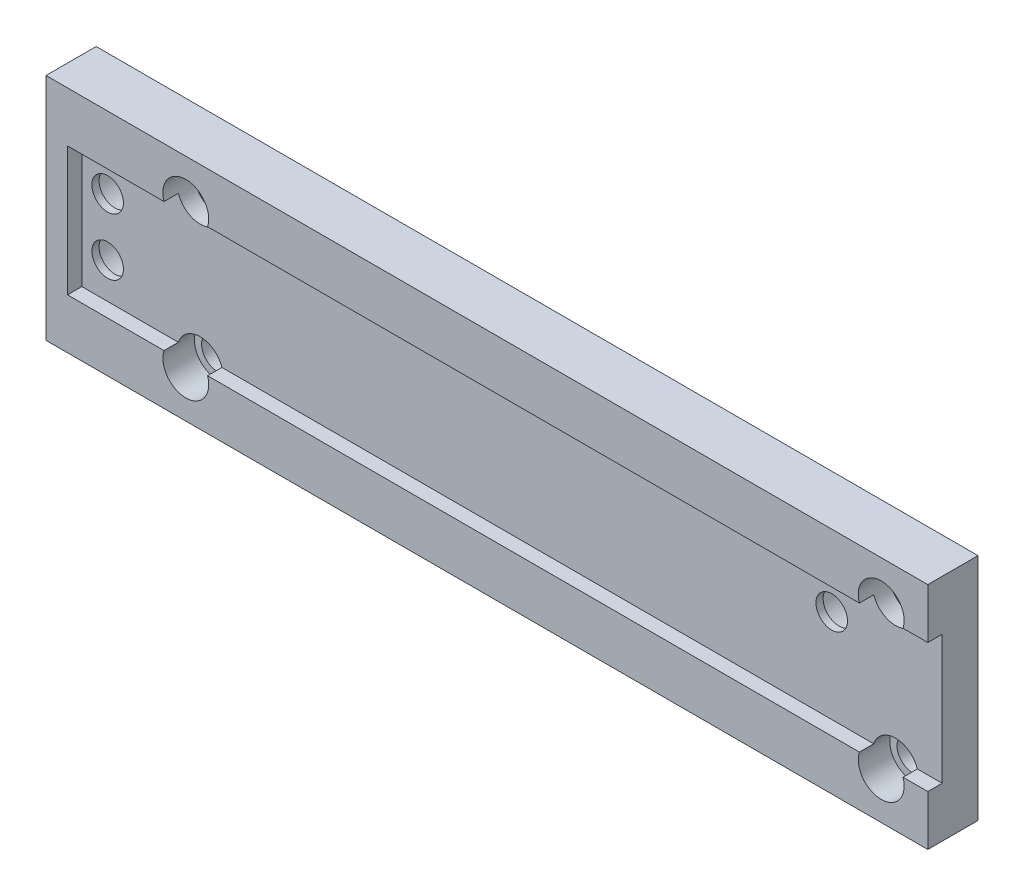
ISO-10303-21;
HEADER;
FILE_DESCRIPTION(('STEP AP214'),'2;1');
FILE_NAME('part.step','',(''),(''),'','','');
FILE_SCHEMA(('AUTOMOTIVE_DESIGN { 1 0 10303 214 1 1 1 1 }'));
ENDSEC;
DATA;
#1=APPLICATION_CONTEXT('core data for automotive mechanical design processes');
#2=APPLICATION_PROTOCOL_DEFINITION('international standard','automotive_design',2000,#1);
#3=PRODUCT_CONTEXT('',#1,'mechanical');
#4=PRODUCT('Part','Part','',(#3));
#5=PRODUCT_RELATED_PRODUCT_CATEGORY('part','',(#4));
#6=PRODUCT_DEFINITION_FORMATION('','',#4);
#7=PRODUCT_DEFINITION_CONTEXT('part definition',#1,'design');
#8=PRODUCT_DEFINITION('design','',#6,#7);
#9=PRODUCT_DEFINITION_SHAPE('','',#8);
#10=(LENGTH_UNIT() NAMED_UNIT(*) SI_UNIT(.MILLI.,.METRE.));
#11=(NAMED_UNIT(*) PLANE_ANGLE_UNIT() SI_UNIT($,.RADIAN.));
#12=(NAMED_UNIT(*) SI_UNIT($,.STERADIAN.) SOLID_ANGLE_UNIT());
#13=UNCERTAINTY_MEASURE_WITH_UNIT(LENGTH_MEASURE(1.E-05),#10,'distance_accuracy_value','');
#14=(GEOMETRIC_REPRESENTATION_CONTEXT(3) GLOBAL_UNCERTAINTY_ASSIGNED_CONTEXT((#13)) GLOBAL_UNIT_ASSIGNED_CONTEXT((#10,
#11,#12)) REPRESENTATION_CONTEXT('',''));
#15=CARTESIAN_POINT('',(0.,0.,0.));
#16=DIRECTION('',(0.,0.,1.));
#17=DIRECTION('',(1.,0.,0.));
#18=AXIS2_PLACEMENT_3D('',#15,#16,#17);
#19=CARTESIAN_POINT('',(-27.45,2.,0.));
#20=DIRECTION('',(0.,0.,1.));
#21=DIRECTION('',(1.,0.,0.));
#22=AXIS2_PLACEMENT_3D('',#19,#20,#21);
#23=CYLINDRICAL_SURFACE('',#22,1.1);
#24=CARTESIAN_POINT('',(-27.45,2.,2.5));
#25=DIRECTION('',(0.,0.,1.));
#26=DIRECTION('',(1.,0.,0.));
#27=AXIS2_PLACEMENT_3D('',#24,#25,#26);
#28=CIRCLE('',#27,1.1);
#29=CARTESIAN_POINT('',(-26.35,2.,2.5));
#30=VERTEX_POINT('',#29);
#31=EDGE_CURVE('E188',#30,#30,#28,.T.);
#32=ORIENTED_EDGE('',*,*,#31,.T.);
#33=EDGE_LOOP('',(#32));
#34=FACE_BOUND('',#33,.T.);
#35=CARTESIAN_POINT('',(-27.45,2.,2.));
#36=DIRECTION('',(0.,0.,-1.));
#37=DIRECTION('',(-1.,0.,0.));
#38=AXIS2_PLACEMENT_3D('',#35,#36,#37);
#39=CIRCLE('',#38,1.1);
#40=CARTESIAN_POINT('',(-28.55,2.,2.));
#41=VERTEX_POINT('',#40);
#42=EDGE_CURVE('E45',#41,#41,#39,.F.);
#43=ORIENTED_EDGE('',*,*,#42,.F.);
#44=EDGE_LOOP('',(#43));
#45=FACE_BOUND('',#44,.T.);
#46=ADVANCED_FACE('F41',(#34,#45),#23,.F.);
#47=CARTESIAN_POINT('',(-27.45,-2.,0.));
#48=DIRECTION('',(0.,0.,1.));
#49=DIRECTION('',(1.,0.,0.));
#50=AXIS2_PLACEMENT_3D('',#47,#48,#49);
#51=CYLINDRICAL_SURFACE('',#50,1.1);
#52=CARTESIAN_POINT('',(-27.45,-2.,2.5));
#53=DIRECTION('',(0.,0.,1.));
#54=DIRECTION('',(1.,0.,0.));
#55=AXIS2_PLACEMENT_3D('',#52,#53,#54);
#56=CIRCLE('',#55,1.1);
#57=CARTESIAN_POINT('',(-26.35,-2.,2.5));
#58=VERTEX_POINT('',#57);
#59=EDGE_CURVE('E194',#58,#58,#56,.T.);
#60=ORIENTED_EDGE('',*,*,#59,.T.);
#61=EDGE_LOOP('',(#60));
#62=FACE_BOUND('',#61,.T.);
#63=CARTESIAN_POINT('',(-27.45,-2.,2.));
#64=DIRECTION('',(0.,0.,-1.));
#65=DIRECTION('',(-1.,0.,0.));
#66=AXIS2_PLACEMENT_3D('',#63,#64,#65);
#67=CIRCLE('',#66,1.1);
#68=CARTESIAN_POINT('',(-28.55,-2.,2.));
#69=VERTEX_POINT('',#68);
#70=EDGE_CURVE('E300',#69,#69,#67,.F.);
#71=ORIENTED_EDGE('',*,*,#70,.F.);
#72=EDGE_LOOP('',(#71));
#73=FACE_BOUND('',#72,.T.);
#74=ADVANCED_FACE('F464',(#62,#73),#51,.F.);
#75=CARTESIAN_POINT('',(23.05,2.,0.));
#76=DIRECTION('',(0.,0.,1.));
#77=DIRECTION('',(1.,0.,0.));
#78=AXIS2_PLACEMENT_3D('',#75,#76,#77);
#79=CYLINDRICAL_SURFACE('',#78,1.1);
#80=CARTESIAN_POINT('',(23.05,2.,2.5));
#81=DIRECTION('',(0.,0.,1.));
#82=DIRECTION('',(1.,0.,0.));
#83=AXIS2_PLACEMENT_3D('',#80,#81,#82);
#84=CIRCLE('',#83,1.1);
#85=CARTESIAN_POINT('',(24.15,2.,2.5));
#86=VERTEX_POINT('',#85);
#87=EDGE_CURVE('E373',#86,#86,#84,.T.);
#88=ORIENTED_EDGE('',*,*,#87,.T.);
#89=EDGE_LOOP('',(#88));
#90=FACE_BOUND('',#89,.T.);
#91=CARTESIAN_POINT('',(23.05,2.,2.));
#92=DIRECTION('',(0.,0.,-1.));
#93=DIRECTION('',(-1.,0.,0.));
#94=AXIS2_PLACEMENT_3D('',#91,#92,#93);
#95=CIRCLE('',#94,1.1);
#96=CARTESIAN_POINT('',(21.95,2.,2.));
#97=VERTEX_POINT('',#96);
#98=EDGE_CURVE('E297',#97,#97,#95,.F.);
#99=ORIENTED_EDGE('',*,*,#98,.F.);
#100=EDGE_LOOP('',(#99));
#101=FACE_BOUND('',#100,.T.);
#102=ADVANCED_FACE('F470',(#90,#101),#79,.F.);
#103=CARTESIAN_POINT('',(-29.25,-4.5,2.5));
#104=DIRECTION('',(0.,-1.,0.));
#105=DIRECTION('',(0.,0.,-1.));
#106=AXIS2_PLACEMENT_3D('',#103,#104,#105);
#107=PLANE('',#106);
#108=DIRECTION('',(1.,0.,0.));
#109=VECTOR('',#108,1.);
#110=CARTESIAN_POINT('',(-29.25,-4.5,2.5));
#111=LINE('',#110,#109);
#112=CARTESIAN_POINT('',(-19.4801315846429,-4.5,2.5));
#113=VERTEX_POINT('',#112);
#114=CARTESIAN_POINT('',(25.9801315846429,-4.5,2.5));
#115=VERTEX_POINT('',#114);
#116=EDGE_CURVE('E394',#113,#115,#111,.T.);
#117=ORIENTED_EDGE('',*,*,#116,.F.);
#118=DIRECTION('',(0.,0.,1.));
#119=VECTOR('',#118,1.);
#120=CARTESIAN_POINT('',(-19.4801315846429,-4.5,1.3));
#121=LINE('',#120,#119);
#122=CARTESIAN_POINT('',(-19.4801315846429,-4.5,3.5));
#123=VERTEX_POINT('',#122);
#124=EDGE_CURVE('E66',#113,#123,#121,.T.);
#125=ORIENTED_EDGE('',*,*,#124,.T.);
#126=DIRECTION('',(1.,0.,0.));
#127=VECTOR('',#126,1.);
#128=CARTESIAN_POINT('',(-29.25,-4.5,3.5));
#129=LINE('',#128,#127);
#130=CARTESIAN_POINT('',(25.9801315846429,-4.5,3.5));
#131=VERTEX_POINT('',#130);
#132=EDGE_CURVE('E207',#123,#131,#129,.T.);
#133=ORIENTED_EDGE('',*,*,#132,.T.);
#134=DIRECTION('',(0.,0.,1.));
#135=VECTOR('',#134,1.);
#136=CARTESIAN_POINT('',(25.9801315846429,-4.5,1.3));
#137=LINE('',#136,#135);
#138=EDGE_CURVE('E178',#131,#115,#137,.F.);
#139=ORIENTED_EDGE('',*,*,#138,.T.);
#140=EDGE_LOOP('',(#117,#125,#133,#139));
#141=FACE_BOUND('',#140,.T.);
#142=ADVANCED_FACE('F436',(#141),#107,.F.);
#143=CARTESIAN_POINT('',(29.0198684153571,-4.5,2.5));
#144=VERTEX_POINT('',#143);
#145=CARTESIAN_POINT('',(30.75,-4.5,2.5));
#146=VERTEX_POINT('',#145);
#147=EDGE_CURVE('E391',#144,#146,#111,.T.);
#148=ORIENTED_EDGE('',*,*,#147,.F.);
#149=DIRECTION('',(0.,0.,1.));
#150=VECTOR('',#149,1.);
#151=CARTESIAN_POINT('',(29.0198684153571,-4.5,1.3));
#152=LINE('',#151,#150);
#153=CARTESIAN_POINT('',(29.0198684153571,-4.5,3.5));
#154=VERTEX_POINT('',#153);
#155=EDGE_CURVE('E59',#144,#154,#152,.T.);
#156=ORIENTED_EDGE('',*,*,#155,.T.);
#157=CARTESIAN_POINT('',(30.75,-4.5,3.5));
#158=VERTEX_POINT('',#157);
#159=EDGE_CURVE('E204',#154,#158,#129,.T.);
#160=ORIENTED_EDGE('',*,*,#159,.T.);
#161=DIRECTION('',(0.,0.,1.));
#162=VECTOR('',#161,1.);
#163=CARTESIAN_POINT('',(30.75,-4.5,2.5));
#164=LINE('',#163,#162);
#165=EDGE_CURVE('E214',#146,#158,#164,.T.);
#166=ORIENTED_EDGE('',*,*,#165,.F.);
#167=EDGE_LOOP('',(#148,#156,#160,#166));
#168=FACE_BOUND('',#167,.T.);
#169=ADVANCED_FACE('F407',(#168),#107,.F.);
#170=CARTESIAN_POINT('',(-29.25,4.5,2.5));
#171=DIRECTION('',(0.,1.,0.));
#172=DIRECTION('',(0.,0.,1.));
#173=AXIS2_PLACEMENT_3D('',#170,#171,#172);
#174=PLANE('',#173);
#175=DIRECTION('',(-1.,0.,0.));
#176=VECTOR('',#175,1.);
#177=CARTESIAN_POINT('',(-29.25,4.5,2.5));
#178=LINE('',#177,#176);
#179=CARTESIAN_POINT('',(25.9801315846429,4.5,2.5));
#180=VERTEX_POINT('',#179);
#181=CARTESIAN_POINT('',(-19.4801315846429,4.5,2.5));
#182=VERTEX_POINT('',#181);
#183=EDGE_CURVE('E388',#180,#182,#178,.T.);
#184=ORIENTED_EDGE('',*,*,#183,.F.);
#185=DIRECTION('',(0.,0.,1.));
#186=VECTOR('',#185,1.);
#187=CARTESIAN_POINT('',(25.9801315846429,4.5,1.3));
#188=LINE('',#187,#186);
#189=CARTESIAN_POINT('',(25.9801315846429,4.5,3.5));
#190=VERTEX_POINT('',#189);
#191=EDGE_CURVE('E363',#180,#190,#188,.T.);
#192=ORIENTED_EDGE('',*,*,#191,.T.);
#193=DIRECTION('',(-1.,0.,0.));
#194=VECTOR('',#193,1.);
#195=CARTESIAN_POINT('',(-29.25,4.5,3.5));
#196=LINE('',#195,#194);
#197=CARTESIAN_POINT('',(-19.4801315846429,4.5,3.5));
#198=VERTEX_POINT('',#197);
#199=EDGE_CURVE('E187',#190,#198,#196,.T.);
#200=ORIENTED_EDGE('',*,*,#199,.T.);
#201=DIRECTION('',(0.,0.,1.));
#202=VECTOR('',#201,1.);
#203=CARTESIAN_POINT('',(-19.4801315846429,4.5,1.3));
#204=LINE('',#203,#202);
#205=EDGE_CURVE('E161',#198,#182,#204,.F.);
#206=ORIENTED_EDGE('',*,*,#205,.T.);
#207=EDGE_LOOP('',(#184,#192,#200,#206));
#208=FACE_BOUND('',#207,.T.);
#209=ADVANCED_FACE('F421',(#208),#174,.F.);
#210=CARTESIAN_POINT('',(-22.5198684153571,4.5,2.5));
#211=VERTEX_POINT('',#210);
#212=CARTESIAN_POINT('',(-29.25,4.5,2.5));
#213=VERTEX_POINT('',#212);
#214=EDGE_CURVE('E176',#211,#213,#178,.T.);
#215=ORIENTED_EDGE('',*,*,#214,.F.);
#216=DIRECTION('',(0.,0.,1.));
#217=VECTOR('',#216,1.);
#218=CARTESIAN_POINT('',(-22.5198684153571,4.5,1.3));
#219=LINE('',#218,#217);
#220=CARTESIAN_POINT('',(-22.5198684153571,4.5,3.5));
#221=VERTEX_POINT('',#220);
#222=EDGE_CURVE('E158',#211,#221,#219,.T.);
#223=ORIENTED_EDGE('',*,*,#222,.T.);
#224=CARTESIAN_POINT('',(-29.25,4.5,3.5));
#225=VERTEX_POINT('',#224);
#226=EDGE_CURVE('E174',#221,#225,#196,.T.);
#227=ORIENTED_EDGE('',*,*,#226,.T.);
#228=DIRECTION('',(0.,0.,1.));
#229=VECTOR('',#228,1.);
#230=CARTESIAN_POINT('',(-29.25,4.5,2.5));
#231=LINE('',#230,#229);
#232=EDGE_CURVE('E222',#213,#225,#231,.T.);
#233=ORIENTED_EDGE('',*,*,#232,.F.);
#234=EDGE_LOOP('',(#215,#223,#227,#233));
#235=FACE_BOUND('',#234,.T.);
#236=ADVANCED_FACE('F172',(#235),#174,.F.);
#237=CARTESIAN_POINT('',(30.75,8.,3.5));
#238=DIRECTION('',(-1.,0.,0.));
#239=DIRECTION('',(0.,0.,1.));
#240=AXIS2_PLACEMENT_3D('',#237,#238,#239);
#241=PLANE('',#240);
#242=DIRECTION('',(0.,1.,0.));
#243=VECTOR('',#242,1.);
#244=CARTESIAN_POINT('',(30.75,4.5,2.5));
#245=LINE('',#244,#243);
#246=CARTESIAN_POINT('',(30.75,4.5,2.5));
#247=VERTEX_POINT('',#246);
#248=EDGE_CURVE('E213',#146,#247,#245,.T.);
#249=ORIENTED_EDGE('',*,*,#248,.F.);
#250=ORIENTED_EDGE('',*,*,#165,.T.);
#251=DIRECTION('',(0.,1.,0.));
#252=VECTOR('',#251,1.);
#253=CARTESIAN_POINT('',(30.75,8.,3.5));
#254=LINE('',#253,#252);
#255=CARTESIAN_POINT('',(30.75,-8.,3.5));
#256=VERTEX_POINT('',#255);
#257=EDGE_CURVE('E229',#256,#158,#254,.T.);
#258=ORIENTED_EDGE('',*,*,#257,.F.);
#259=DIRECTION('',(0.,0.,-1.));
#260=VECTOR('',#259,1.);
#261=CARTESIAN_POINT('',(30.75,-8.,3.5));
#262=LINE('',#261,#260);
#263=CARTESIAN_POINT('',(30.75,-8.,0.));
#264=VERTEX_POINT('',#263);
#265=EDGE_CURVE('E243',#256,#264,#262,.T.);
#266=ORIENTED_EDGE('',*,*,#265,.T.);
#267=DIRECTION('',(0.,1.,0.));
#268=VECTOR('',#267,1.);
#269=CARTESIAN_POINT('',(30.75,8.,0.));
#270=LINE('',#269,#268);
#271=CARTESIAN_POINT('',(30.75,8.,0.));
#272=VERTEX_POINT('',#271);
#273=EDGE_CURVE('E218',#264,#272,#270,.T.);
#274=ORIENTED_EDGE('',*,*,#273,.T.);
#275=DIRECTION('',(0.,0.,-1.));
#276=VECTOR('',#275,1.);
#277=CARTESIAN_POINT('',(30.75,8.,3.5));
#278=LINE('',#277,#276);
#279=CARTESIAN_POINT('',(30.75,8.,3.5));
#280=VERTEX_POINT('',#279);
#281=EDGE_CURVE('E267',#280,#272,#278,.T.);
#282=ORIENTED_EDGE('',*,*,#281,.F.);
#283=CARTESIAN_POINT('',(30.75,4.5,3.5));
#284=VERTEX_POINT('',#283);
#285=EDGE_CURVE('E234',#284,#280,#254,.T.);
#286=ORIENTED_EDGE('',*,*,#285,.F.);
#287=DIRECTION('',(0.,0.,1.));
#288=VECTOR('',#287,1.);
#289=CARTESIAN_POINT('',(30.75,4.5,2.5));
#290=LINE('',#289,#288);
#291=EDGE_CURVE('E225',#247,#284,#290,.T.);
#292=ORIENTED_EDGE('',*,*,#291,.F.);
#293=EDGE_LOOP('',(#249,#250,#258,#266,#274,#282,#286,#292));
#294=FACE_BOUND('',#293,.T.);
#295=ADVANCED_FACE('F43',(#294),#241,.F.);
#296=CARTESIAN_POINT('',(-30.75,8.,3.5));
#297=DIRECTION('',(0.,-1.,0.));
#298=DIRECTION('',(0.,0.,-1.));
#299=AXIS2_PLACEMENT_3D('',#296,#297,#298);
#300=PLANE('',#299);
#301=DIRECTION('',(-1.,0.,0.));
#302=VECTOR('',#301,1.);
#303=CARTESIAN_POINT('',(-30.75,8.,0.));
#304=LINE('',#303,#302);
#305=CARTESIAN_POINT('',(-30.75,8.,0.));
#306=VERTEX_POINT('',#305);
#307=EDGE_CURVE('E247',#272,#306,#304,.T.);
#308=ORIENTED_EDGE('',*,*,#307,.T.);
#309=DIRECTION('',(0.,0.,-1.));
#310=VECTOR('',#309,1.);
#311=CARTESIAN_POINT('',(-30.75,8.,3.5));
#312=LINE('',#311,#310);
#313=CARTESIAN_POINT('',(-30.75,8.,3.5));
#314=VERTEX_POINT('',#313);
#315=EDGE_CURVE('E263',#314,#306,#312,.T.);
#316=ORIENTED_EDGE('',*,*,#315,.F.);
#317=DIRECTION('',(-1.,0.,0.));
#318=VECTOR('',#317,1.);
#319=CARTESIAN_POINT('',(-30.75,8.,3.5));
#320=LINE('',#319,#318);
#321=EDGE_CURVE('E233',#280,#314,#320,.T.);
#322=ORIENTED_EDGE('',*,*,#321,.F.);
#323=ORIENTED_EDGE('',*,*,#281,.T.);
#324=EDGE_LOOP('',(#308,#316,#322,#323));
#325=FACE_BOUND('',#324,.T.);
#326=ADVANCED_FACE('F448',(#325),#300,.F.);
#327=CARTESIAN_POINT('',(-30.75,8.,3.5));
#328=DIRECTION('',(1.,0.,0.));
#329=DIRECTION('',(0.,1.,0.));
#330=AXIS2_PLACEMENT_3D('',#327,#328,#329);
#331=PLANE('',#330);
#332=DIRECTION('',(0.,-1.,0.));
#333=VECTOR('',#332,1.);
#334=CARTESIAN_POINT('',(-30.75,8.,0.));
#335=LINE('',#334,#333);
#336=CARTESIAN_POINT('',(-30.75,-8.,0.));
#337=VERTEX_POINT('',#336);
#338=EDGE_CURVE('E250',#306,#337,#335,.T.);
#339=ORIENTED_EDGE('',*,*,#338,.T.);
#340=DIRECTION('',(0.,0.,-1.));
#341=VECTOR('',#340,1.);
#342=CARTESIAN_POINT('',(-30.75,-8.,3.5));
#343=LINE('',#342,#341);
#344=CARTESIAN_POINT('',(-30.75,-8.,3.5));
#345=VERTEX_POINT('',#344);
#346=EDGE_CURVE('E259',#345,#337,#343,.T.);
#347=ORIENTED_EDGE('',*,*,#346,.F.);
#348=DIRECTION('',(0.,-1.,0.));
#349=VECTOR('',#348,1.);
#350=CARTESIAN_POINT('',(-30.75,8.,3.5));
#351=LINE('',#350,#349);
#352=EDGE_CURVE('E237',#314,#345,#351,.T.);
#353=ORIENTED_EDGE('',*,*,#352,.F.);
#354=ORIENTED_EDGE('',*,*,#315,.T.);
#355=EDGE_LOOP('',(#339,#347,#353,#354));
#356=FACE_BOUND('',#355,.T.);
#357=ADVANCED_FACE('F452',(#356),#331,.F.);
#358=CARTESIAN_POINT('',(-30.75,-8.,3.5));
#359=DIRECTION('',(0.,1.,0.));
#360=DIRECTION('',(0.,0.,1.));
#361=AXIS2_PLACEMENT_3D('',#358,#359,#360);
#362=PLANE('',#361);
#363=DIRECTION('',(1.,0.,0.));
#364=VECTOR('',#363,1.);
#365=CARTESIAN_POINT('',(-30.75,-8.,0.));
#366=LINE('',#365,#364);
#367=EDGE_CURVE('E253',#337,#264,#366,.T.);
#368=ORIENTED_EDGE('',*,*,#367,.T.);
#369=ORIENTED_EDGE('',*,*,#265,.F.);
#370=DIRECTION('',(1.,0.,0.));
#371=VECTOR('',#370,1.);
#372=CARTESIAN_POINT('',(-30.75,-8.,3.5));
#373=LINE('',#372,#371);
#374=EDGE_CURVE('E240',#345,#256,#373,.T.);
#375=ORIENTED_EDGE('',*,*,#374,.F.);
#376=ORIENTED_EDGE('',*,*,#346,.T.);
#377=EDGE_LOOP('',(#368,#369,#375,#376));
#378=FACE_BOUND('',#377,.T.);
#379=ADVANCED_FACE('F453',(#378),#362,.F.);
#380=CARTESIAN_POINT('',(0.,0.,3.5));
#381=DIRECTION('',(0.,0.,1.));
#382=DIRECTION('',(1.,0.,0.));
#383=AXIS2_PLACEMENT_3D('',#380,#381,#382);
#384=PLANE('',#383);
#385=CARTESIAN_POINT('',(-21.,-5.,3.5));
#386=DIRECTION('',(0.,0.,1.));
#387=DIRECTION('',(1.,0.,0.));
#388=AXIS2_PLACEMENT_3D('',#385,#386,#387);
#389=CIRCLE('',#388,1.6);
#390=CARTESIAN_POINT('',(-22.5198684153571,-4.5,3.5));
#391=VERTEX_POINT('',#390);
#392=EDGE_CURVE('E341',#391,#123,#389,.T.);
#393=ORIENTED_EDGE('',*,*,#392,.F.);
#394=CARTESIAN_POINT('',(-29.25,-4.5,3.5));
#395=VERTEX_POINT('',#394);
#396=EDGE_CURVE('E209',#395,#391,#129,.T.);
#397=ORIENTED_EDGE('',*,*,#396,.F.);
#398=DIRECTION('',(0.,-1.,0.));
#399=VECTOR('',#398,1.);
#400=CARTESIAN_POINT('',(-29.25,4.5,3.5));
#401=LINE('',#400,#399);
#402=EDGE_CURVE('E185',#225,#395,#401,.T.);
#403=ORIENTED_EDGE('',*,*,#402,.F.);
#404=ORIENTED_EDGE('',*,*,#226,.F.);
#405=CARTESIAN_POINT('',(-21.,5.,3.5));
#406=DIRECTION('',(0.,0.,1.));
#407=DIRECTION('',(1.,0.,0.));
#408=AXIS2_PLACEMENT_3D('',#405,#406,#407);
#409=CIRCLE('',#408,1.6);
#410=EDGE_CURVE('E155',#198,#221,#409,.T.);
#411=ORIENTED_EDGE('',*,*,#410,.F.);
#412=ORIENTED_EDGE('',*,*,#199,.F.);
#413=CARTESIAN_POINT('',(27.5,5.,3.5));
#414=DIRECTION('',(0.,0.,1.));
#415=DIRECTION('',(1.,0.,0.));
#416=AXIS2_PLACEMENT_3D('',#413,#414,#415);
#417=CIRCLE('',#416,1.6);
#418=CARTESIAN_POINT('',(29.0198684153571,4.5,3.5));
#419=VERTEX_POINT('',#418);
#420=EDGE_CURVE('E335',#419,#190,#417,.T.);
#421=ORIENTED_EDGE('',*,*,#420,.F.);
#422=EDGE_CURVE('E190',#284,#419,#196,.T.);
#423=ORIENTED_EDGE('',*,*,#422,.F.);
#424=ORIENTED_EDGE('',*,*,#285,.T.);
#425=ORIENTED_EDGE('',*,*,#321,.T.);
#426=ORIENTED_EDGE('',*,*,#352,.T.);
#427=ORIENTED_EDGE('',*,*,#374,.T.);
#428=ORIENTED_EDGE('',*,*,#257,.T.);
#429=ORIENTED_EDGE('',*,*,#159,.F.);
#430=CARTESIAN_POINT('',(27.5,-5.,3.5));
#431=DIRECTION('',(0.,0.,1.));
#432=DIRECTION('',(1.,0.,0.));
#433=AXIS2_PLACEMENT_3D('',#430,#431,#432);
#434=CIRCLE('',#433,1.6);
#435=EDGE_CURVE('E296',#131,#154,#434,.T.);
#436=ORIENTED_EDGE('',*,*,#435,.F.);
#437=ORIENTED_EDGE('',*,*,#132,.F.);
#438=EDGE_LOOP('',(#393,#397,#403,#404,#411,#412,#421,#423,#424,#425,#426,#427,#428,#429,#436,#437));
#439=FACE_BOUND('',#438,.T.);
#440=ADVANCED_FACE('F182',(#439),#384,.T.);
#441=CARTESIAN_POINT('',(0.,0.,0.));
#442=DIRECTION('',(0.,0.,1.));
#443=DIRECTION('',(1.,0.,0.));
#444=AXIS2_PLACEMENT_3D('',#441,#442,#443);
#445=PLANE('',#444);
#446=CARTESIAN_POINT('',(23.05,2.,0.));
#447=DIRECTION('',(0.,0.,-1.));
#448=DIRECTION('',(-1.,0.,0.));
#449=AXIS2_PLACEMENT_3D('',#446,#447,#448);
#450=CIRCLE('',#449,1.95);
#451=CARTESIAN_POINT('',(21.1,2.,0.));
#452=VERTEX_POINT('',#451);
#453=EDGE_CURVE('E490',#452,#452,#450,.T.);
#454=ORIENTED_EDGE('',*,*,#453,.F.);
#455=EDGE_LOOP('',(#454));
#456=FACE_BOUND('',#455,.T.);
#457=CARTESIAN_POINT('',(-27.45,-2.,0.));
#458=DIRECTION('',(0.,0.,-1.));
#459=DIRECTION('',(-1.,0.,0.));
#460=AXIS2_PLACEMENT_3D('',#457,#458,#459);
#461=CIRCLE('',#460,1.95);
#462=CARTESIAN_POINT('',(-29.4,-2.,0.));
#463=VERTEX_POINT('',#462);
#464=EDGE_CURVE('E494',#463,#463,#461,.T.);
#465=ORIENTED_EDGE('',*,*,#464,.F.);
#466=EDGE_LOOP('',(#465));
#467=FACE_BOUND('',#466,.T.);
#468=CARTESIAN_POINT('',(-27.45,2.,0.));
#469=DIRECTION('',(0.,0.,-1.));
#470=DIRECTION('',(-1.,0.,0.));
#471=AXIS2_PLACEMENT_3D('',#468,#469,#470);
#472=CIRCLE('',#471,1.95);
#473=CARTESIAN_POINT('',(-29.4,2.,0.));
#474=VERTEX_POINT('',#473);
#475=EDGE_CURVE('E323',#474,#474,#472,.T.);
#476=ORIENTED_EDGE('',*,*,#475,.F.);
#477=EDGE_LOOP('',(#476));
#478=FACE_BOUND('',#477,.T.);
#479=CARTESIAN_POINT('',(-21.,-5.,0.));
#480=DIRECTION('',(0.,0.,1.));
#481=DIRECTION('',(1.,0.,0.));
#482=AXIS2_PLACEMENT_3D('',#479,#480,#481);
#483=CIRCLE('',#482,1.1);
#484=CARTESIAN_POINT('',(-19.9,-5.,0.));
#485=VERTEX_POINT('',#484);
#486=EDGE_CURVE('E319',#485,#485,#483,.T.);
#487=ORIENTED_EDGE('',*,*,#486,.T.);
#488=EDGE_LOOP('',(#487));
#489=FACE_BOUND('',#488,.T.);
#490=CARTESIAN_POINT('',(27.5,5.,0.));
#491=DIRECTION('',(0.,0.,1.));
#492=DIRECTION('',(1.,0.,0.));
#493=AXIS2_PLACEMENT_3D('',#490,#491,#492);
#494=CIRCLE('',#493,1.1);
#495=CARTESIAN_POINT('',(28.6,5.,0.));
#496=VERTEX_POINT('',#495);
#497=EDGE_CURVE('E313',#496,#496,#494,.T.);
#498=ORIENTED_EDGE('',*,*,#497,.T.);
#499=EDGE_LOOP('',(#498));
#500=FACE_BOUND('',#499,.T.);
#501=CARTESIAN_POINT('',(27.5,-5.,0.));
#502=DIRECTION('',(0.,0.,1.));
#503=DIRECTION('',(1.,0.,0.));
#504=AXIS2_PLACEMENT_3D('',#501,#502,#503);
#505=CIRCLE('',#504,1.1);
#506=CARTESIAN_POINT('',(28.6,-5.,0.));
#507=VERTEX_POINT('',#506);
#508=EDGE_CURVE('E308',#507,#507,#505,.T.);
#509=ORIENTED_EDGE('',*,*,#508,.T.);
#510=EDGE_LOOP('',(#509));
#511=FACE_BOUND('',#510,.T.);
#512=CARTESIAN_POINT('',(-21.,5.,0.));
#513=DIRECTION('',(0.,0.,1.));
#514=DIRECTION('',(1.,0.,0.));
#515=AXIS2_PLACEMENT_3D('',#512,#513,#514);
#516=CIRCLE('',#515,1.1);
#517=CARTESIAN_POINT('',(-19.9,5.,0.));
#518=VERTEX_POINT('',#517);
#519=EDGE_CURVE('E284',#518,#518,#516,.T.);
#520=ORIENTED_EDGE('',*,*,#519,.T.);
#521=EDGE_LOOP('',(#520));
#522=FACE_BOUND('',#521,.T.);
#523=ORIENTED_EDGE('',*,*,#273,.F.);
#524=ORIENTED_EDGE('',*,*,#367,.F.);
#525=ORIENTED_EDGE('',*,*,#338,.F.);
#526=ORIENTED_EDGE('',*,*,#307,.F.);
#527=EDGE_LOOP('',(#523,#524,#525,#526));
#528=FACE_BOUND('',#527,.T.);
#529=ADVANCED_FACE('F444',(#456,#467,#478,#489,#500,#511,#522,#528),#445,.F.);
#530=ORIENTED_EDGE('',*,*,#396,.T.);
#531=DIRECTION('',(0.,0.,1.));
#532=VECTOR('',#531,1.);
#533=CARTESIAN_POINT('',(-22.5198684153571,-4.5,1.3));
#534=LINE('',#533,#532);
#535=CARTESIAN_POINT('',(-22.5198684153571,-4.5,2.5));
#536=VERTEX_POINT('',#535);
#537=EDGE_CURVE('E367',#391,#536,#534,.F.);
#538=ORIENTED_EDGE('',*,*,#537,.T.);
#539=CARTESIAN_POINT('',(-29.25,-4.5,2.5));
#540=VERTEX_POINT('',#539);
#541=EDGE_CURVE('E228',#540,#536,#111,.T.);
#542=ORIENTED_EDGE('',*,*,#541,.F.);
#543=DIRECTION('',(0.,0.,1.));
#544=VECTOR('',#543,1.);
#545=CARTESIAN_POINT('',(-29.25,-4.5,2.5));
#546=LINE('',#545,#544);
#547=EDGE_CURVE('E219',#540,#395,#546,.T.);
#548=ORIENTED_EDGE('',*,*,#547,.T.);
#549=EDGE_LOOP('',(#530,#538,#542,#548));
#550=FACE_BOUND('',#549,.T.);
#551=ADVANCED_FACE('F428',(#550),#107,.F.);
#552=CARTESIAN_POINT('',(-29.25,4.5,2.5));
#553=DIRECTION('',(-1.,0.,0.));
#554=DIRECTION('',(0.,-1.,0.));
#555=AXIS2_PLACEMENT_3D('',#552,#553,#554);
#556=PLANE('',#555);
#557=ORIENTED_EDGE('',*,*,#402,.T.);
#558=ORIENTED_EDGE('',*,*,#547,.F.);
#559=DIRECTION('',(0.,-1.,0.));
#560=VECTOR('',#559,1.);
#561=CARTESIAN_POINT('',(-29.25,4.5,2.5));
#562=LINE('',#561,#560);
#563=EDGE_CURVE('E387',#213,#540,#562,.T.);
#564=ORIENTED_EDGE('',*,*,#563,.F.);
#565=ORIENTED_EDGE('',*,*,#232,.T.);
#566=EDGE_LOOP('',(#557,#558,#564,#565));
#567=FACE_BOUND('',#566,.T.);
#568=ADVANCED_FACE('F426',(#567),#556,.F.);
#569=ORIENTED_EDGE('',*,*,#422,.T.);
#570=DIRECTION('',(0.,0.,1.));
#571=VECTOR('',#570,1.);
#572=CARTESIAN_POINT('',(29.0198684153571,4.5,1.3));
#573=LINE('',#572,#571);
#574=CARTESIAN_POINT('',(29.0198684153571,4.5,2.5));
#575=VERTEX_POINT('',#574);
#576=EDGE_CURVE('E360',#419,#575,#573,.F.);
#577=ORIENTED_EDGE('',*,*,#576,.T.);
#578=EDGE_CURVE('E383',#247,#575,#178,.T.);
#579=ORIENTED_EDGE('',*,*,#578,.F.);
#580=ORIENTED_EDGE('',*,*,#291,.T.);
#581=EDGE_LOOP('',(#569,#577,#579,#580));
#582=FACE_BOUND('',#581,.T.);
#583=ADVANCED_FACE('F413',(#582),#174,.F.);
#584=CARTESIAN_POINT('',(0.,0.,2.5));
#585=DIRECTION('',(0.,0.,1.));
#586=DIRECTION('',(1.,0.,0.));
#587=AXIS2_PLACEMENT_3D('',#584,#585,#586);
#588=PLANE('',#587);
#589=CARTESIAN_POINT('',(-21.,-5.,2.5));
#590=DIRECTION('',(0.,0.,1.));
#591=DIRECTION('',(1.,0.,0.));
#592=AXIS2_PLACEMENT_3D('',#589,#590,#591);
#593=CIRCLE('',#592,1.6);
#594=EDGE_CURVE('E11',#113,#536,#593,.T.);
#595=ORIENTED_EDGE('',*,*,#594,.F.);
#596=ORIENTED_EDGE('',*,*,#116,.T.);
#597=CARTESIAN_POINT('',(27.5,-5.,2.5));
#598=DIRECTION('',(0.,0.,1.));
#599=DIRECTION('',(1.,0.,0.));
#600=AXIS2_PLACEMENT_3D('',#597,#598,#599);
#601=CIRCLE('',#600,1.6);
#602=EDGE_CURVE('E274',#144,#115,#601,.T.);
#603=ORIENTED_EDGE('',*,*,#602,.F.);
#604=ORIENTED_EDGE('',*,*,#147,.T.);
#605=ORIENTED_EDGE('',*,*,#248,.T.);
#606=ORIENTED_EDGE('',*,*,#578,.T.);
#607=CARTESIAN_POINT('',(27.5,5.,2.5));
#608=DIRECTION('',(0.,0.,1.));
#609=DIRECTION('',(1.,0.,0.));
#610=AXIS2_PLACEMENT_3D('',#607,#608,#609);
#611=CIRCLE('',#610,1.6);
#612=EDGE_CURVE('E51',#180,#575,#611,.T.);
#613=ORIENTED_EDGE('',*,*,#612,.F.);
#614=ORIENTED_EDGE('',*,*,#183,.T.);
#615=CARTESIAN_POINT('',(-21.,5.,2.5));
#616=DIRECTION('',(0.,0.,1.));
#617=DIRECTION('',(1.,0.,0.));
#618=AXIS2_PLACEMENT_3D('',#615,#616,#617);
#619=CIRCLE('',#618,1.6);
#620=EDGE_CURVE('E271',#211,#182,#619,.T.);
#621=ORIENTED_EDGE('',*,*,#620,.F.);
#622=ORIENTED_EDGE('',*,*,#214,.T.);
#623=ORIENTED_EDGE('',*,*,#563,.T.);
#624=ORIENTED_EDGE('',*,*,#541,.T.);
#625=EDGE_LOOP('',(#595,#596,#603,#604,#605,#606,#613,#614,#621,#622,#623,#624));
#626=FACE_BOUND('',#625,.T.);
#627=ORIENTED_EDGE('',*,*,#87,.F.);
#628=EDGE_LOOP('',(#627));
#629=FACE_BOUND('',#628,.T.);
#630=ORIENTED_EDGE('',*,*,#59,.F.);
#631=EDGE_LOOP('',(#630));
#632=FACE_BOUND('',#631,.T.);
#633=ORIENTED_EDGE('',*,*,#31,.F.);
#634=EDGE_LOOP('',(#633));
#635=FACE_BOUND('',#634,.T.);
#636=ADVANCED_FACE('F402',(#626,#629,#632,#635),#588,.T.);
#637=CARTESIAN_POINT('',(-21.,5.,1.3));
#638=DIRECTION('',(0.,0.,1.));
#639=DIRECTION('',(1.,0.,0.));
#640=AXIS2_PLACEMENT_3D('',#637,#638,#639);
#641=CYLINDRICAL_SURFACE('',#640,1.6);
#642=CARTESIAN_POINT('',(-21.,5.,1.3));
#643=DIRECTION('',(0.,0.,1.));
#644=DIRECTION('',(1.,0.,0.));
#645=AXIS2_PLACEMENT_3D('',#642,#643,#644);
#646=CIRCLE('',#645,1.6);
#647=CARTESIAN_POINT('',(-19.4,5.,1.3));
#648=VERTEX_POINT('',#647);
#649=EDGE_CURVE('E167',#648,#648,#646,.T.);
#650=ORIENTED_EDGE('',*,*,#649,.F.);
#651=EDGE_LOOP('',(#650));
#652=FACE_BOUND('',#651,.T.);
#653=ORIENTED_EDGE('',*,*,#620,.T.);
#654=ORIENTED_EDGE('',*,*,#205,.F.);
#655=ORIENTED_EDGE('',*,*,#410,.T.);
#656=ORIENTED_EDGE('',*,*,#222,.F.);
#657=EDGE_LOOP('',(#653,#654,#655,#656));
#658=FACE_BOUND('',#657,.T.);
#659=ADVANCED_FACE('F157',(#652,#658),#641,.F.);
#660=CARTESIAN_POINT('',(-21.,5.,1.3));
#661=DIRECTION('',(0.,0.,1.));
#662=DIRECTION('',(1.,0.,0.));
#663=AXIS2_PLACEMENT_3D('',#660,#661,#662);
#664=PLANE('',#663);
#665=CARTESIAN_POINT('',(-21.,5.,1.3));
#666=DIRECTION('',(0.,0.,1.));
#667=DIRECTION('',(1.,0.,0.));
#668=AXIS2_PLACEMENT_3D('',#665,#666,#667);
#669=CIRCLE('',#668,1.1);
#670=CARTESIAN_POINT('',(-19.9,5.,1.3));
#671=VERTEX_POINT('',#670);
#672=EDGE_CURVE('E292',#671,#671,#669,.T.);
#673=ORIENTED_EDGE('',*,*,#672,.F.);
#674=EDGE_LOOP('',(#673));
#675=FACE_BOUND('',#674,.T.);
#676=ORIENTED_EDGE('',*,*,#649,.T.);
#677=EDGE_LOOP('',(#676));
#678=FACE_BOUND('',#677,.T.);
#679=ADVANCED_FACE('F529',(#675,#678),#664,.T.);
#680=CARTESIAN_POINT('',(27.5,-5.,1.3));
#681=DIRECTION('',(0.,0.,1.));
#682=DIRECTION('',(1.,0.,0.));
#683=AXIS2_PLACEMENT_3D('',#680,#681,#682);
#684=CYLINDRICAL_SURFACE('',#683,1.6);
#685=CARTESIAN_POINT('',(27.5,-5.,1.3));
#686=DIRECTION('',(0.,0.,1.));
#687=DIRECTION('',(1.,0.,0.));
#688=AXIS2_PLACEMENT_3D('',#685,#686,#687);
#689=CIRCLE('',#688,1.6);
#690=CARTESIAN_POINT('',(29.1,-5.,1.3));
#691=VERTEX_POINT('',#690);
#692=EDGE_CURVE('E331',#691,#691,#689,.T.);
#693=ORIENTED_EDGE('',*,*,#692,.F.);
#694=EDGE_LOOP('',(#693));
#695=FACE_BOUND('',#694,.T.);
#696=ORIENTED_EDGE('',*,*,#602,.T.);
#697=ORIENTED_EDGE('',*,*,#138,.F.);
#698=ORIENTED_EDGE('',*,*,#435,.T.);
#699=ORIENTED_EDGE('',*,*,#155,.F.);
#700=EDGE_LOOP('',(#696,#697,#698,#699));
#701=FACE_BOUND('',#700,.T.);
#702=ADVANCED_FACE('F437',(#695,#701),#684,.F.);
#703=CARTESIAN_POINT('',(27.5,-5.,1.3));
#704=DIRECTION('',(0.,0.,1.));
#705=DIRECTION('',(1.,0.,0.));
#706=AXIS2_PLACEMENT_3D('',#703,#704,#705);
#707=PLANE('',#706);
#708=CARTESIAN_POINT('',(27.5,-5.,1.3));
#709=DIRECTION('',(0.,0.,1.));
#710=DIRECTION('',(1.,0.,0.));
#711=AXIS2_PLACEMENT_3D('',#708,#709,#710);
#712=CIRCLE('',#711,1.1);
#713=CARTESIAN_POINT('',(28.6,-5.,1.3));
#714=VERTEX_POINT('',#713);
#715=EDGE_CURVE('E288',#714,#714,#712,.T.);
#716=ORIENTED_EDGE('',*,*,#715,.F.);
#717=EDGE_LOOP('',(#716));
#718=FACE_BOUND('',#717,.T.);
#719=ORIENTED_EDGE('',*,*,#692,.T.);
#720=EDGE_LOOP('',(#719));
#721=FACE_BOUND('',#720,.T.);
#722=ADVANCED_FACE('F523',(#718,#721),#707,.T.);
#723=CARTESIAN_POINT('',(27.5,5.,1.3));
#724=DIRECTION('',(0.,0.,1.));
#725=DIRECTION('',(1.,0.,0.));
#726=AXIS2_PLACEMENT_3D('',#723,#724,#725);
#727=CYLINDRICAL_SURFACE('',#726,1.6);
#728=CARTESIAN_POINT('',(27.5,5.,1.3));
#729=DIRECTION('',(0.,0.,1.));
#730=DIRECTION('',(1.,0.,0.));
#731=AXIS2_PLACEMENT_3D('',#728,#729,#730);
#732=CIRCLE('',#731,1.6);
#733=CARTESIAN_POINT('',(29.1,5.,1.3));
#734=VERTEX_POINT('',#733);
#735=EDGE_CURVE('E344',#734,#734,#732,.T.);
#736=ORIENTED_EDGE('',*,*,#735,.F.);
#737=EDGE_LOOP('',(#736));
#738=FACE_BOUND('',#737,.T.);
#739=ORIENTED_EDGE('',*,*,#612,.T.);
#740=ORIENTED_EDGE('',*,*,#576,.F.);
#741=ORIENTED_EDGE('',*,*,#420,.T.);
#742=ORIENTED_EDGE('',*,*,#191,.F.);
#743=EDGE_LOOP('',(#739,#740,#741,#742));
#744=FACE_BOUND('',#743,.T.);
#745=ADVANCED_FACE('F417',(#738,#744),#727,.F.);
#746=CARTESIAN_POINT('',(27.5,5.,1.3));
#747=DIRECTION('',(0.,0.,1.));
#748=DIRECTION('',(1.,0.,0.));
#749=AXIS2_PLACEMENT_3D('',#746,#747,#748);
#750=PLANE('',#749);
#751=CARTESIAN_POINT('',(27.5,5.,1.3));
#752=DIRECTION('',(0.,0.,1.));
#753=DIRECTION('',(1.,0.,0.));
#754=AXIS2_PLACEMENT_3D('',#751,#752,#753);
#755=CIRCLE('',#754,1.1);
#756=CARTESIAN_POINT('',(28.6,5.,1.3));
#757=VERTEX_POINT('',#756);
#758=EDGE_CURVE('E283',#757,#757,#755,.T.);
#759=ORIENTED_EDGE('',*,*,#758,.F.);
#760=EDGE_LOOP('',(#759));
#761=FACE_BOUND('',#760,.T.);
#762=ORIENTED_EDGE('',*,*,#735,.T.);
#763=EDGE_LOOP('',(#762));
#764=FACE_BOUND('',#763,.T.);
#765=ADVANCED_FACE('F538',(#761,#764),#750,.T.);
#766=CARTESIAN_POINT('',(-21.,-5.,1.3));
#767=DIRECTION('',(0.,0.,1.));
#768=DIRECTION('',(1.,0.,0.));
#769=AXIS2_PLACEMENT_3D('',#766,#767,#768);
#770=CYLINDRICAL_SURFACE('',#769,1.6);
#771=CARTESIAN_POINT('',(-21.,-5.,1.3));
#772=DIRECTION('',(0.,0.,1.));
#773=DIRECTION('',(1.,0.,0.));
#774=AXIS2_PLACEMENT_3D('',#771,#772,#773);
#775=CIRCLE('',#774,1.6);
#776=CARTESIAN_POINT('',(-19.4,-5.,1.3));
#777=VERTEX_POINT('',#776);
#778=EDGE_CURVE('E168',#777,#777,#775,.T.);
#779=ORIENTED_EDGE('',*,*,#778,.F.);
#780=EDGE_LOOP('',(#779));
#781=FACE_BOUND('',#780,.T.);
#782=ORIENTED_EDGE('',*,*,#594,.T.);
#783=ORIENTED_EDGE('',*,*,#537,.F.);
#784=ORIENTED_EDGE('',*,*,#392,.T.);
#785=ORIENTED_EDGE('',*,*,#124,.F.);
#786=EDGE_LOOP('',(#782,#783,#784,#785));
#787=FACE_BOUND('',#786,.T.);
#788=ADVANCED_FACE('F429',(#781,#787),#770,.F.);
#789=CARTESIAN_POINT('',(-21.,-5.,1.3));
#790=DIRECTION('',(0.,0.,1.));
#791=DIRECTION('',(1.,0.,0.));
#792=AXIS2_PLACEMENT_3D('',#789,#790,#791);
#793=PLANE('',#792);
#794=CARTESIAN_POINT('',(-21.,-5.,1.3));
#795=DIRECTION('',(0.,0.,1.));
#796=DIRECTION('',(1.,0.,0.));
#797=AXIS2_PLACEMENT_3D('',#794,#795,#796);
#798=CIRCLE('',#797,1.1);
#799=CARTESIAN_POINT('',(-19.9,-5.,1.3));
#800=VERTEX_POINT('',#799);
#801=EDGE_CURVE('E279',#800,#800,#798,.T.);
#802=ORIENTED_EDGE('',*,*,#801,.F.);
#803=EDGE_LOOP('',(#802));
#804=FACE_BOUND('',#803,.T.);
#805=ORIENTED_EDGE('',*,*,#778,.T.);
#806=EDGE_LOOP('',(#805));
#807=FACE_BOUND('',#806,.T.);
#808=ADVANCED_FACE('F531',(#804,#807),#793,.T.);
#809=CARTESIAN_POINT('',(-21.,-5.,0.));
#810=DIRECTION('',(0.,0.,1.));
#811=DIRECTION('',(1.,0.,0.));
#812=AXIS2_PLACEMENT_3D('',#809,#810,#811);
#813=CYLINDRICAL_SURFACE('',#812,1.1);
#814=ORIENTED_EDGE('',*,*,#801,.T.);
#815=EDGE_LOOP('',(#814));
#816=FACE_BOUND('',#815,.T.);
#817=ORIENTED_EDGE('',*,*,#486,.F.);
#818=EDGE_LOOP('',(#817));
#819=FACE_BOUND('',#818,.T.);
#820=ADVANCED_FACE('F534',(#816,#819),#813,.F.);
#821=CARTESIAN_POINT('',(27.5,5.,0.));
#822=DIRECTION('',(0.,0.,1.));
#823=DIRECTION('',(1.,0.,0.));
#824=AXIS2_PLACEMENT_3D('',#821,#822,#823);
#825=CYLINDRICAL_SURFACE('',#824,1.1);
#826=ORIENTED_EDGE('',*,*,#758,.T.);
#827=EDGE_LOOP('',(#826));
#828=FACE_BOUND('',#827,.T.);
#829=ORIENTED_EDGE('',*,*,#497,.F.);
#830=EDGE_LOOP('',(#829));
#831=FACE_BOUND('',#830,.T.);
#832=ADVANCED_FACE('F517',(#828,#831),#825,.F.);
#833=CARTESIAN_POINT('',(27.5,-5.,0.));
#834=DIRECTION('',(0.,0.,1.));
#835=DIRECTION('',(1.,0.,0.));
#836=AXIS2_PLACEMENT_3D('',#833,#834,#835);
#837=CYLINDRICAL_SURFACE('',#836,1.1);
#838=ORIENTED_EDGE('',*,*,#715,.T.);
#839=EDGE_LOOP('',(#838));
#840=FACE_BOUND('',#839,.T.);
#841=ORIENTED_EDGE('',*,*,#508,.F.);
#842=EDGE_LOOP('',(#841));
#843=FACE_BOUND('',#842,.T.);
#844=ADVANCED_FACE('F507',(#840,#843),#837,.F.);
#845=CARTESIAN_POINT('',(-21.,5.,0.));
#846=DIRECTION('',(0.,0.,1.));
#847=DIRECTION('',(1.,0.,0.));
#848=AXIS2_PLACEMENT_3D('',#845,#846,#847);
#849=CYLINDRICAL_SURFACE('',#848,1.1);
#850=ORIENTED_EDGE('',*,*,#672,.T.);
#851=EDGE_LOOP('',(#850));
#852=FACE_BOUND('',#851,.T.);
#853=ORIENTED_EDGE('',*,*,#519,.F.);
#854=EDGE_LOOP('',(#853));
#855=FACE_BOUND('',#854,.T.);
#856=ADVANCED_FACE('F504',(#852,#855),#849,.F.);
#857=CARTESIAN_POINT('',(23.05,2.,2.));
#858=DIRECTION('',(0.,0.,-1.));
#859=DIRECTION('',(-1.,0.,0.));
#860=AXIS2_PLACEMENT_3D('',#857,#858,#859);
#861=PLANE('',#860);
#862=CARTESIAN_POINT('',(23.05,2.,2.));
#863=DIRECTION('',(0.,0.,-1.));
#864=DIRECTION('',(-1.,0.,0.));
#865=AXIS2_PLACEMENT_3D('',#862,#863,#864);
#866=CIRCLE('',#865,1.95);
#867=CARTESIAN_POINT('',(21.1,2.,2.));
#868=VERTEX_POINT('',#867);
#869=EDGE_CURVE('E301',#868,#868,#866,.T.);
#870=ORIENTED_EDGE('',*,*,#869,.T.);
#871=EDGE_LOOP('',(#870));
#872=FACE_BOUND('',#871,.T.);
#873=ORIENTED_EDGE('',*,*,#98,.T.);
#874=EDGE_LOOP('',(#873));
#875=FACE_BOUND('',#874,.T.);
#876=ADVANCED_FACE('F506',(#872,#875),#861,.T.);
#877=CARTESIAN_POINT('',(23.05,2.,2.));
#878=DIRECTION('',(0.,0.,-1.));
#879=DIRECTION('',(-1.,0.,0.));
#880=AXIS2_PLACEMENT_3D('',#877,#878,#879);
#881=CYLINDRICAL_SURFACE('',#880,1.95);
#882=ORIENTED_EDGE('',*,*,#869,.F.);
#883=EDGE_LOOP('',(#882));
#884=FACE_BOUND('',#883,.T.);
#885=ORIENTED_EDGE('',*,*,#453,.T.);
#886=EDGE_LOOP('',(#885));
#887=FACE_BOUND('',#886,.T.);
#888=ADVANCED_FACE('F514',(#884,#887),#881,.F.);
#889=CARTESIAN_POINT('',(-27.45,-2.,2.));
#890=DIRECTION('',(0.,0.,-1.));
#891=DIRECTION('',(-1.,0.,0.));
#892=AXIS2_PLACEMENT_3D('',#889,#890,#891);
#893=PLANE('',#892);
#894=CARTESIAN_POINT('',(-27.45,-2.,2.));
#895=DIRECTION('',(0.,0.,-1.));
#896=DIRECTION('',(-1.,0.,0.));
#897=AXIS2_PLACEMENT_3D('',#894,#895,#896);
#898=CIRCLE('',#897,1.95);
#899=CARTESIAN_POINT('',(-29.4,-2.,2.));
#900=VERTEX_POINT('',#899);
#901=EDGE_CURVE('E696',#900,#900,#898,.T.);
#902=ORIENTED_EDGE('',*,*,#901,.T.);
#903=EDGE_LOOP('',(#902));
#904=FACE_BOUND('',#903,.T.);
#905=ORIENTED_EDGE('',*,*,#70,.T.);
#906=EDGE_LOOP('',(#905));
#907=FACE_BOUND('',#906,.T.);
#908=ADVANCED_FACE('F645',(#904,#907),#893,.T.);
#909=CARTESIAN_POINT('',(-27.45,-2.,2.));
#910=DIRECTION('',(0.,0.,-1.));
#911=DIRECTION('',(-1.,0.,0.));
#912=AXIS2_PLACEMENT_3D('',#909,#910,#911);
#913=CYLINDRICAL_SURFACE('',#912,1.95);
#914=ORIENTED_EDGE('',*,*,#901,.F.);
#915=EDGE_LOOP('',(#914));
#916=FACE_BOUND('',#915,.T.);
#917=ORIENTED_EDGE('',*,*,#464,.T.);
#918=EDGE_LOOP('',(#917));
#919=FACE_BOUND('',#918,.T.);
#920=ADVANCED_FACE('F655',(#916,#919),#913,.F.);
#921=CARTESIAN_POINT('',(-27.45,2.,2.));
#922=DIRECTION('',(0.,0.,-1.));
#923=DIRECTION('',(-1.,0.,0.));
#924=AXIS2_PLACEMENT_3D('',#921,#922,#923);
#925=PLANE('',#924);
#926=CARTESIAN_POINT('',(-27.45,2.,2.));
#927=DIRECTION('',(0.,0.,-1.));
#928=DIRECTION('',(-1.,0.,0.));
#929=AXIS2_PLACEMENT_3D('',#926,#927,#928);
#930=CIRCLE('',#929,1.95);
#931=CARTESIAN_POINT('',(-29.4,2.,2.));
#932=VERTEX_POINT('',#931);
#933=EDGE_CURVE('E692',#932,#932,#930,.T.);
#934=ORIENTED_EDGE('',*,*,#933,.T.);
#935=EDGE_LOOP('',(#934));
#936=FACE_BOUND('',#935,.T.);
#937=ORIENTED_EDGE('',*,*,#42,.T.);
#938=EDGE_LOOP('',(#937));
#939=FACE_BOUND('',#938,.T.);
#940=ADVANCED_FACE('F665',(#936,#939),#925,.T.);
#941=CARTESIAN_POINT('',(-27.45,2.,2.));
#942=DIRECTION('',(0.,0.,-1.));
#943=DIRECTION('',(-1.,0.,0.));
#944=AXIS2_PLACEMENT_3D('',#941,#942,#943);
#945=CYLINDRICAL_SURFACE('',#944,1.95);
#946=ORIENTED_EDGE('',*,*,#933,.F.);
#947=EDGE_LOOP('',(#946));
#948=FACE_BOUND('',#947,.T.);
#949=ORIENTED_EDGE('',*,*,#475,.T.);
#950=EDGE_LOOP('',(#949));
#951=FACE_BOUND('',#950,.T.);
#952=ADVANCED_FACE('F675',(#948,#951),#945,.F.);
#953=CLOSED_SHELL('',(#46,#74,#102,#142,#169,#209,#236,#295,#326,#357,#379,#440,#529,#551,#568,
#583,#636,#659,#679,#702,#722,#745,#765,#788,#808,#820,#832,#844,#856,#876,#888,#908,#920,#940,#952));
#954=MANIFOLD_SOLID_BREP('B2',#953);
#955=ADVANCED_BREP_SHAPE_REPRESENTATION('',(#18,#954),#14);
#956=SHAPE_DEFINITION_REPRESENTATION(#9,#955);
ENDSEC;
END-ISO-10303-21;
